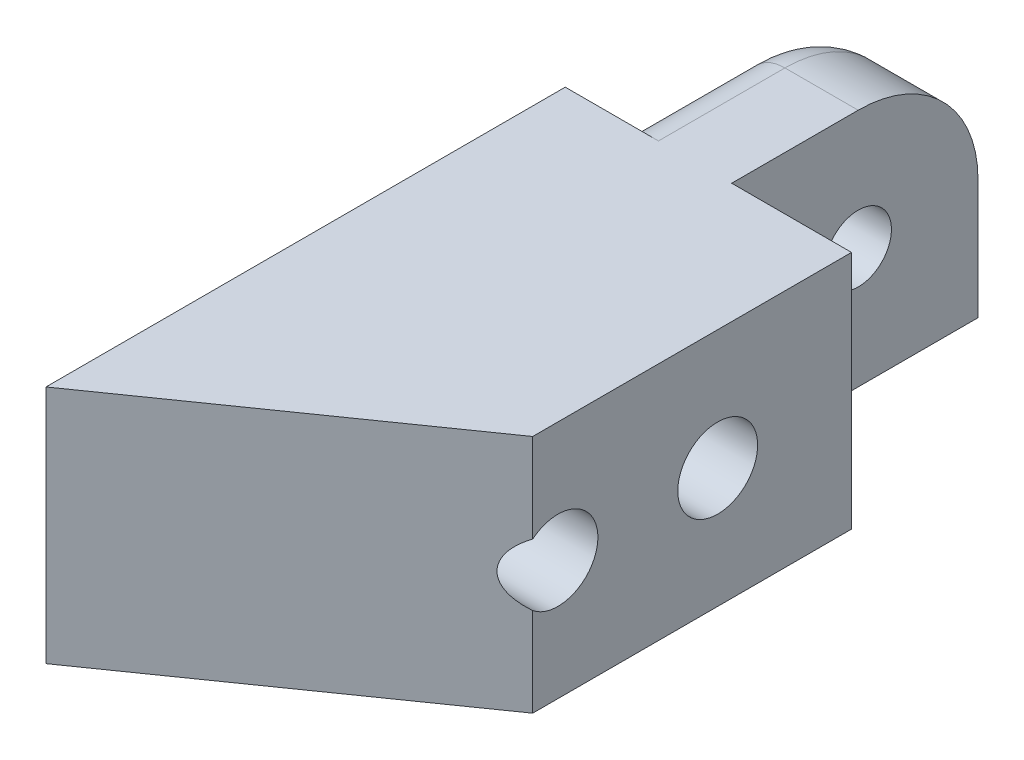
ISO-10303-21;
HEADER;
FILE_DESCRIPTION(('STEP AP214'),'2;1');
FILE_NAME('part.step','',(''),(''),'','','');
FILE_SCHEMA(('AUTOMOTIVE_DESIGN { 1 0 10303 214 1 1 1 1 }'));
ENDSEC;
DATA;
#1=APPLICATION_CONTEXT('core data for automotive mechanical design processes');
#2=APPLICATION_PROTOCOL_DEFINITION('international standard','automotive_design',2000,#1);
#3=PRODUCT_CONTEXT('',#1,'mechanical');
#4=PRODUCT('Part','Part','',(#3));
#5=PRODUCT_RELATED_PRODUCT_CATEGORY('part','',(#4));
#6=PRODUCT_DEFINITION_FORMATION('','',#4);
#7=PRODUCT_DEFINITION_CONTEXT('part definition',#1,'design');
#8=PRODUCT_DEFINITION('design','',#6,#7);
#9=PRODUCT_DEFINITION_SHAPE('','',#8);
#10=(LENGTH_UNIT() NAMED_UNIT(*) SI_UNIT(.MILLI.,.METRE.));
#11=(NAMED_UNIT(*) PLANE_ANGLE_UNIT() SI_UNIT($,.RADIAN.));
#12=(NAMED_UNIT(*) SI_UNIT($,.STERADIAN.) SOLID_ANGLE_UNIT());
#13=UNCERTAINTY_MEASURE_WITH_UNIT(LENGTH_MEASURE(1.E-05),#10,'distance_accuracy_value','');
#14=(GEOMETRIC_REPRESENTATION_CONTEXT(3) GLOBAL_UNCERTAINTY_ASSIGNED_CONTEXT((#13)) GLOBAL_UNIT_ASSIGNED_CONTEXT((#10,
#11,#12)) REPRESENTATION_CONTEXT('',''));
#15=CARTESIAN_POINT('',(0.,0.,0.));
#16=DIRECTION('',(0.,0.,1.));
#17=DIRECTION('',(1.,0.,0.));
#18=AXIS2_PLACEMENT_3D('',#15,#16,#17);
#19=CARTESIAN_POINT('',(-4.25000000000001,18.,-11.9727689642455));
#20=DIRECTION('',(0.,0.,1.));
#21=DIRECTION('',(1.,0.,0.));
#22=AXIS2_PLACEMENT_3D('',#19,#20,#21);
#23=PLANE('',#22);
#24=DIRECTION('',(-1.,0.,0.));
#25=VECTOR('',#24,1.);
#26=CARTESIAN_POINT('',(-4.25000000000001,0.,-11.9727689642455));
#27=LINE('',#26,#25);
#28=CARTESIAN_POINT('',(-4.25000000000001,0.,-11.9727689642455));
#29=VERTEX_POINT('',#28);
#30=CARTESIAN_POINT('',(-8.25000000000001,0.,-11.9727689642455));
#31=VERTEX_POINT('',#30);
#32=EDGE_CURVE('E208',#29,#31,#27,.T.);
#33=ORIENTED_EDGE('',*,*,#32,.T.);
#34=DIRECTION('',(0.,-1.,0.));
#35=VECTOR('',#34,1.);
#36=CARTESIAN_POINT('',(-8.25000000000001,18.,-11.9727689642455));
#37=LINE('',#36,#35);
#38=CARTESIAN_POINT('',(-8.25000000000001,18.,-11.9727689642455));
#39=VERTEX_POINT('',#38);
#40=EDGE_CURVE('E163',#39,#31,#37,.T.);
#41=ORIENTED_EDGE('',*,*,#40,.F.);
#42=DIRECTION('',(-1.,0.,0.));
#43=VECTOR('',#42,1.);
#44=CARTESIAN_POINT('',(-4.25000000000001,18.,-11.9727689642455));
#45=LINE('',#44,#43);
#46=CARTESIAN_POINT('',(-1.25000000000001,18.,-11.9727689642455));
#47=VERTEX_POINT('',#46);
#48=EDGE_CURVE('E209',#47,#39,#45,.T.);
#49=ORIENTED_EDGE('',*,*,#48,.F.);
#50=CARTESIAN_POINT('',(-1.25000000000001,15.,-11.9727689642455));
#51=DIRECTION('',(0.,0.,1.));
#52=DIRECTION('',(1.,0.,0.));
#53=AXIS2_PLACEMENT_3D('',#50,#51,#52);
#54=CIRCLE('',#53,3.);
#55=CARTESIAN_POINT('',(-4.25000000000001,15.,-11.9727689642455));
#56=VERTEX_POINT('',#55);
#57=EDGE_CURVE('E11',#47,#56,#54,.T.);
#58=ORIENTED_EDGE('',*,*,#57,.T.);
#59=DIRECTION('',(0.,-1.,0.));
#60=VECTOR('',#59,1.);
#61=CARTESIAN_POINT('',(-4.25000000000001,18.,-11.9727689642455));
#62=LINE('',#61,#60);
#63=EDGE_CURVE('E146',#56,#29,#62,.T.);
#64=ORIENTED_EDGE('',*,*,#63,.T.);
#65=EDGE_LOOP('',(#33,#41,#49,#58,#64));
#66=FACE_BOUND('',#65,.T.);
#67=ADVANCED_FACE('F33',(#66),#23,.F.);
#68=CARTESIAN_POINT('',(-8.25000000000001,18.,-11.9727689642455));
#69=DIRECTION('',(1.,0.,0.));
#70=DIRECTION('',(0.,0.,-1.));
#71=AXIS2_PLACEMENT_3D('',#68,#69,#70);
#72=PLANE('',#71);
#73=CARTESIAN_POINT('',(-8.25,9.,10.0772310357545));
#74=DIRECTION('',(-1.,0.,0.));
#75=DIRECTION('',(0.,0.,1.));
#76=AXIS2_PLACEMENT_3D('',#73,#74,#75);
#77=CIRCLE('',#76,3.);
#78=CARTESIAN_POINT('',(-8.25,9.,13.0772310357545));
#79=VERTEX_POINT('',#78);
#80=EDGE_CURVE('E189',#79,#79,#77,.T.);
#81=ORIENTED_EDGE('',*,*,#80,.F.);
#82=EDGE_LOOP('',(#81));
#83=FACE_BOUND('',#82,.T.);
#84=CARTESIAN_POINT('',(-8.25000000000001,9.,-1.92276896424554));
#85=DIRECTION('',(-1.,0.,0.));
#86=DIRECTION('',(0.,0.,1.));
#87=AXIS2_PLACEMENT_3D('',#84,#85,#86);
#88=CIRCLE('',#87,3.);
#89=CARTESIAN_POINT('',(-8.25000000000001,9.,1.07723103575446));
#90=VERTEX_POINT('',#89);
#91=EDGE_CURVE('E199',#90,#90,#88,.T.);
#92=ORIENTED_EDGE('',*,*,#91,.F.);
#93=EDGE_LOOP('',(#92));
#94=FACE_BOUND('',#93,.T.);
#95=DIRECTION('',(0.,0.,1.));
#96=VECTOR('',#95,1.);
#97=CARTESIAN_POINT('',(-8.25000000000001,0.,-11.9727689642455));
#98=LINE('',#97,#96);
#99=CARTESIAN_POINT('',(-8.25,0.,27.0272310357545));
#100=VERTEX_POINT('',#99);
#101=EDGE_CURVE('E224',#31,#100,#98,.T.);
#102=ORIENTED_EDGE('',*,*,#101,.T.);
#103=DIRECTION('',(0.,-1.,0.));
#104=VECTOR('',#103,1.);
#105=CARTESIAN_POINT('',(-8.25,18.,27.0272310357545));
#106=LINE('',#105,#104);
#107=CARTESIAN_POINT('',(-8.25,18.,27.0272310357545));
#108=VERTEX_POINT('',#107);
#109=EDGE_CURVE('E160',#108,#100,#106,.T.);
#110=ORIENTED_EDGE('',*,*,#109,.F.);
#111=DIRECTION('',(0.,0.,1.));
#112=VECTOR('',#111,1.);
#113=CARTESIAN_POINT('',(-8.25000000000001,18.,-11.9727689642455));
#114=LINE('',#113,#112);
#115=EDGE_CURVE('E212',#39,#108,#114,.T.);
#116=ORIENTED_EDGE('',*,*,#115,.F.);
#117=ORIENTED_EDGE('',*,*,#40,.T.);
#118=EDGE_LOOP('',(#102,#110,#116,#117));
#119=FACE_BOUND('',#118,.T.);
#120=ADVANCED_FACE('F260',(#83,#94,#119),#72,.F.);
#121=CARTESIAN_POINT('',(-8.25,18.,27.0272310357545));
#122=DIRECTION('',(-0.57357643635105,0.,-0.819152044288989));
#123=DIRECTION('',(-0.819152044288989,0.,0.57357643635105));
#124=AXIS2_PLACEMENT_3D('',#121,#122,#123);
#125=PLANE('',#124);
#126=DIRECTION('',(0.,-1.,0.));
#127=VECTOR('',#126,1.);
#128=CARTESIAN_POINT('',(13.25,18.,11.9727689642455));
#129=LINE('',#128,#127);
#130=CARTESIAN_POINT('',(13.25,6.6747180898541,11.9727689642455));
#131=VERTEX_POINT('',#130);
#132=CARTESIAN_POINT('',(13.25,0.,11.9727689642455));
#133=VERTEX_POINT('',#132);
#134=EDGE_CURVE('E156',#131,#133,#129,.T.);
#135=ORIENTED_EDGE('',*,*,#134,.F.);
#136=CARTESIAN_POINT('',(15.9571087142786,9.,10.0772310357545));
#137=DIRECTION('',(-0.57357643635105,0.,-0.819152044288989));
#138=DIRECTION('',(-0.819152044288989,0.,0.57357643635105));
#139=AXIS2_PLACEMENT_3D('',#136,#137,#138);
#140=ELLIPSE('',#139,5.23034038686326,3.);
#141=CARTESIAN_POINT('',(13.25,11.3252819101459,11.9727689642455));
#142=VERTEX_POINT('',#141);
#143=EDGE_CURVE('E205',#131,#142,#140,.T.);
#144=ORIENTED_EDGE('',*,*,#143,.T.);
#145=CARTESIAN_POINT('',(13.25,18.,11.9727689642455));
#146=VERTEX_POINT('',#145);
#147=EDGE_CURVE('E157',#146,#142,#129,.T.);
#148=ORIENTED_EDGE('',*,*,#147,.F.);
#149=DIRECTION('',(0.819152044288989,0.,-0.57357643635105));
#150=VECTOR('',#149,1.);
#151=CARTESIAN_POINT('',(-8.25,18.,27.0272310357545));
#152=LINE('',#151,#150);
#153=EDGE_CURVE('E215',#108,#146,#152,.T.);
#154=ORIENTED_EDGE('',*,*,#153,.F.);
#155=ORIENTED_EDGE('',*,*,#109,.T.);
#156=DIRECTION('',(0.819152044288989,0.,-0.57357643635105));
#157=VECTOR('',#156,1.);
#158=CARTESIAN_POINT('',(-8.25,0.,27.0272310357545));
#159=LINE('',#158,#157);
#160=EDGE_CURVE('E226',#100,#133,#159,.T.);
#161=ORIENTED_EDGE('',*,*,#160,.T.);
#162=EDGE_LOOP('',(#135,#144,#148,#154,#155,#161));
#163=FACE_BOUND('',#162,.T.);
#164=ADVANCED_FACE('F265',(#163),#125,.F.);
#165=CARTESIAN_POINT('',(13.25,18.,11.9727689642455));
#166=DIRECTION('',(-1.,0.,0.));
#167=DIRECTION('',(0.,0.,1.));
#168=AXIS2_PLACEMENT_3D('',#165,#166,#167);
#169=PLANE('',#168);
#170=CARTESIAN_POINT('',(13.25,9.,-1.92276896424554));
#171=DIRECTION('',(-1.,0.,0.));
#172=DIRECTION('',(0.,0.,1.));
#173=AXIS2_PLACEMENT_3D('',#170,#171,#172);
#174=CIRCLE('',#173,3.);
#175=CARTESIAN_POINT('',(13.25,9.,1.07723103575446));
#176=VERTEX_POINT('',#175);
#177=EDGE_CURVE('E139',#176,#176,#174,.T.);
#178=ORIENTED_EDGE('',*,*,#177,.T.);
#179=EDGE_LOOP('',(#178));
#180=FACE_BOUND('',#179,.T.);
#181=ORIENTED_EDGE('',*,*,#147,.T.);
#182=CARTESIAN_POINT('',(13.25,9.,10.0772310357545));
#183=DIRECTION('',(-1.,0.,0.));
#184=DIRECTION('',(0.,0.,1.));
#185=AXIS2_PLACEMENT_3D('',#182,#183,#184);
#186=CIRCLE('',#185,3.);
#187=EDGE_CURVE('E194',#142,#131,#186,.T.);
#188=ORIENTED_EDGE('',*,*,#187,.T.);
#189=ORIENTED_EDGE('',*,*,#134,.T.);
#190=DIRECTION('',(0.,0.,-1.));
#191=VECTOR('',#190,1.);
#192=CARTESIAN_POINT('',(13.25,0.,11.9727689642455));
#193=LINE('',#192,#191);
#194=CARTESIAN_POINT('',(13.25,0.,-11.9727689642455));
#195=VERTEX_POINT('',#194);
#196=EDGE_CURVE('E229',#133,#195,#193,.T.);
#197=ORIENTED_EDGE('',*,*,#196,.T.);
#198=DIRECTION('',(0.,-1.,0.));
#199=VECTOR('',#198,1.);
#200=CARTESIAN_POINT('',(13.25,18.,-11.9727689642455));
#201=LINE('',#200,#199);
#202=CARTESIAN_POINT('',(13.25,18.,-11.9727689642455));
#203=VERTEX_POINT('',#202);
#204=EDGE_CURVE('E148',#203,#195,#201,.T.);
#205=ORIENTED_EDGE('',*,*,#204,.F.);
#206=DIRECTION('',(0.,0.,-1.));
#207=VECTOR('',#206,1.);
#208=CARTESIAN_POINT('',(13.25,18.,11.9727689642455));
#209=LINE('',#208,#207);
#210=EDGE_CURVE('E217',#146,#203,#209,.T.);
#211=ORIENTED_EDGE('',*,*,#210,.F.);
#212=EDGE_LOOP('',(#181,#188,#189,#197,#205,#211));
#213=FACE_BOUND('',#212,.T.);
#214=ADVANCED_FACE('F369',(#180,#213),#169,.F.);
#215=CARTESIAN_POINT('',(13.25,18.,-11.9727689642455));
#216=DIRECTION('',(0.,0.,1.));
#217=DIRECTION('',(1.,0.,0.));
#218=AXIS2_PLACEMENT_3D('',#215,#216,#217);
#219=PLANE('',#218);
#220=DIRECTION('',(-1.,0.,0.));
#221=VECTOR('',#220,1.);
#222=CARTESIAN_POINT('',(13.25,0.,-11.9727689642455));
#223=LINE('',#222,#221);
#224=CARTESIAN_POINT('',(4.25,0.,-11.9727689642455));
#225=VERTEX_POINT('',#224);
#226=EDGE_CURVE('E231',#195,#225,#223,.T.);
#227=ORIENTED_EDGE('',*,*,#226,.T.);
#228=DIRECTION('',(0.,-1.,0.));
#229=VECTOR('',#228,1.);
#230=CARTESIAN_POINT('',(4.25,18.,-11.9727689642455));
#231=LINE('',#230,#229);
#232=CARTESIAN_POINT('',(4.25,18.,-11.9727689642455));
#233=VERTEX_POINT('',#232);
#234=EDGE_CURVE('E145',#233,#225,#231,.T.);
#235=ORIENTED_EDGE('',*,*,#234,.F.);
#236=DIRECTION('',(-1.,0.,0.));
#237=VECTOR('',#236,1.);
#238=CARTESIAN_POINT('',(13.25,18.,-11.9727689642455));
#239=LINE('',#238,#237);
#240=EDGE_CURVE('E219',#203,#233,#239,.T.);
#241=ORIENTED_EDGE('',*,*,#240,.F.);
#242=ORIENTED_EDGE('',*,*,#204,.T.);
#243=EDGE_LOOP('',(#227,#235,#241,#242));
#244=FACE_BOUND('',#243,.T.);
#245=ADVANCED_FACE('F361',(#244),#219,.F.);
#246=CARTESIAN_POINT('',(4.25,18.,-11.9727689642455));
#247=DIRECTION('',(-1.,0.,0.));
#248=DIRECTION('',(0.,0.,1.));
#249=AXIS2_PLACEMENT_3D('',#246,#247,#248);
#250=PLANE('',#249);
#251=CARTESIAN_POINT('',(4.25,9.,-21.4727689642455));
#252=DIRECTION('',(-1.,0.,0.));
#253=DIRECTION('',(0.,0.,1.));
#254=AXIS2_PLACEMENT_3D('',#251,#252,#253);
#255=CIRCLE('',#254,2.5);
#256=CARTESIAN_POINT('',(4.25,9.,-18.9727689642455));
#257=VERTEX_POINT('',#256);
#258=EDGE_CURVE('E170',#257,#257,#255,.T.);
#259=ORIENTED_EDGE('',*,*,#258,.T.);
#260=EDGE_LOOP('',(#259));
#261=FACE_BOUND('',#260,.T.);
#262=DIRECTION('',(0.,-1.,0.));
#263=VECTOR('',#262,1.);
#264=CARTESIAN_POINT('',(4.25,18.,-30.4727689642455));
#265=LINE('',#264,#263);
#266=CARTESIAN_POINT('',(4.25,9.,-30.4727689642455));
#267=VERTEX_POINT('',#266);
#268=CARTESIAN_POINT('',(4.25,0.,-30.4727689642455));
#269=VERTEX_POINT('',#268);
#270=EDGE_CURVE('E137',#267,#269,#265,.T.);
#271=ORIENTED_EDGE('',*,*,#270,.F.);
#272=CARTESIAN_POINT('',(4.25,9.,-21.4727689642455));
#273=DIRECTION('',(-1.,0.,0.));
#274=DIRECTION('',(0.,0.,1.));
#275=AXIS2_PLACEMENT_3D('',#272,#273,#274);
#276=CIRCLE('',#275,9.);
#277=CARTESIAN_POINT('',(4.25,18.,-21.4727689642455));
#278=VERTEX_POINT('',#277);
#279=EDGE_CURVE('E124',#267,#278,#276,.F.);
#280=ORIENTED_EDGE('',*,*,#279,.T.);
#281=DIRECTION('',(0.,0.,-1.));
#282=VECTOR('',#281,1.);
#283=CARTESIAN_POINT('',(4.25,18.,-11.9727689642455));
#284=LINE('',#283,#282);
#285=EDGE_CURVE('E150',#233,#278,#284,.T.);
#286=ORIENTED_EDGE('',*,*,#285,.F.);
#287=ORIENTED_EDGE('',*,*,#234,.T.);
#288=DIRECTION('',(0.,0.,-1.));
#289=VECTOR('',#288,1.);
#290=CARTESIAN_POINT('',(4.25,0.,-11.9727689642455));
#291=LINE('',#290,#289);
#292=EDGE_CURVE('E144',#225,#269,#291,.T.);
#293=ORIENTED_EDGE('',*,*,#292,.T.);
#294=EDGE_LOOP('',(#271,#280,#286,#287,#293));
#295=FACE_BOUND('',#294,.T.);
#296=ADVANCED_FACE('F141',(#261,#295),#250,.F.);
#297=CARTESIAN_POINT('',(4.25,18.,-30.4727689642455));
#298=DIRECTION('',(0.,0.,1.));
#299=DIRECTION('',(1.,0.,0.));
#300=AXIS2_PLACEMENT_3D('',#297,#298,#299);
#301=PLANE('',#300);
#302=DIRECTION('',(-1.,0.,0.));
#303=VECTOR('',#302,1.);
#304=CARTESIAN_POINT('',(4.25,0.,-30.4727689642455));
#305=LINE('',#304,#303);
#306=CARTESIAN_POINT('',(-1.25000000000001,0.,-30.4727689642455));
#307=VERTEX_POINT('',#306);
#308=EDGE_CURVE('E234',#269,#307,#305,.T.);
#309=ORIENTED_EDGE('',*,*,#308,.T.);
#310=DIRECTION('',(0.,-1.,0.));
#311=VECTOR('',#310,1.);
#312=CARTESIAN_POINT('',(-1.25000000000001,18.,-30.4727689642455));
#313=LINE('',#312,#311);
#314=CARTESIAN_POINT('',(-1.25000000000001,9.,-30.4727689642455));
#315=VERTEX_POINT('',#314);
#316=EDGE_CURVE('E42',#307,#315,#313,.F.);
#317=ORIENTED_EDGE('',*,*,#316,.T.);
#318=DIRECTION('',(-1.,0.,0.));
#319=VECTOR('',#318,1.);
#320=CARTESIAN_POINT('',(13.25,9.,-30.4727689642455));
#321=LINE('',#320,#319);
#322=EDGE_CURVE('E126',#267,#315,#321,.T.);
#323=ORIENTED_EDGE('',*,*,#322,.F.);
#324=ORIENTED_EDGE('',*,*,#270,.T.);
#325=EDGE_LOOP('',(#309,#317,#323,#324));
#326=FACE_BOUND('',#325,.T.);
#327=ADVANCED_FACE('F136',(#326),#301,.F.);
#328=CARTESIAN_POINT('',(-4.25,18.,-30.4727689642455));
#329=DIRECTION('',(1.,0.,0.));
#330=DIRECTION('',(0.,0.,-1.));
#331=AXIS2_PLACEMENT_3D('',#328,#329,#330);
#332=PLANE('',#331);
#333=CARTESIAN_POINT('',(-4.25,9.,-21.4727689642455));
#334=DIRECTION('',(1.,0.,0.));
#335=DIRECTION('',(0.,0.,-1.));
#336=AXIS2_PLACEMENT_3D('',#333,#334,#335);
#337=CIRCLE('',#336,2.5);
#338=CARTESIAN_POINT('',(-4.25,9.,-23.9727689642455));
#339=VERTEX_POINT('',#338);
#340=EDGE_CURVE('E134',#339,#339,#337,.T.);
#341=ORIENTED_EDGE('',*,*,#340,.T.);
#342=EDGE_LOOP('',(#341));
#343=FACE_BOUND('',#342,.T.);
#344=ORIENTED_EDGE('',*,*,#63,.F.);
#345=DIRECTION('',(0.,0.,1.));
#346=VECTOR('',#345,1.);
#347=CARTESIAN_POINT('',(-4.25,15.,-21.4727689642455));
#348=LINE('',#347,#346);
#349=CARTESIAN_POINT('',(-4.25,15.,-21.4727689642455));
#350=VERTEX_POINT('',#349);
#351=EDGE_CURVE('E177',#56,#350,#348,.F.);
#352=ORIENTED_EDGE('',*,*,#351,.T.);
#353=CARTESIAN_POINT('',(-4.25,9.,-21.4727689642455));
#354=DIRECTION('',(1.,0.,0.));
#355=DIRECTION('',(0.,0.,-1.));
#356=AXIS2_PLACEMENT_3D('',#353,#354,#355);
#357=CIRCLE('',#356,6.);
#358=CARTESIAN_POINT('',(-4.25,9.,-27.4727689642455));
#359=VERTEX_POINT('',#358);
#360=EDGE_CURVE('E175',#350,#359,#357,.F.);
#361=ORIENTED_EDGE('',*,*,#360,.T.);
#362=DIRECTION('',(0.,-1.,0.));
#363=VECTOR('',#362,1.);
#364=CARTESIAN_POINT('',(-4.25,18.,-27.4727689642455));
#365=LINE('',#364,#363);
#366=CARTESIAN_POINT('',(-4.25,0.,-27.4727689642455));
#367=VERTEX_POINT('',#366);
#368=EDGE_CURVE('E173',#359,#367,#365,.T.);
#369=ORIENTED_EDGE('',*,*,#368,.T.);
#370=DIRECTION('',(0.,0.,1.));
#371=VECTOR('',#370,1.);
#372=CARTESIAN_POINT('',(-4.25,0.,-30.4727689642455));
#373=LINE('',#372,#371);
#374=EDGE_CURVE('E213',#367,#29,#373,.T.);
#375=ORIENTED_EDGE('',*,*,#374,.T.);
#376=EDGE_LOOP('',(#344,#352,#361,#369,#375));
#377=FACE_BOUND('',#376,.T.);
#378=ADVANCED_FACE('F239',(#343,#377),#332,.F.);
#379=CARTESIAN_POINT('',(0.,18.,0.));
#380=DIRECTION('',(0.,1.,0.));
#381=DIRECTION('',(0.,0.,1.));
#382=AXIS2_PLACEMENT_3D('',#379,#380,#381);
#383=PLANE('',#382);
#384=DIRECTION('',(-1.,0.,0.));
#385=VECTOR('',#384,1.);
#386=CARTESIAN_POINT('',(13.25,18.,-21.4727689642455));
#387=LINE('',#386,#385);
#388=CARTESIAN_POINT('',(-1.25,18.,-21.4727689642455));
#389=VERTEX_POINT('',#388);
#390=EDGE_CURVE('E129',#389,#278,#387,.F.);
#391=ORIENTED_EDGE('',*,*,#390,.F.);
#392=DIRECTION('',(0.,0.,1.));
#393=VECTOR('',#392,1.);
#394=CARTESIAN_POINT('',(-1.25000000000001,18.,-11.9727689642455));
#395=LINE('',#394,#393);
#396=EDGE_CURVE('E167',#389,#47,#395,.T.);
#397=ORIENTED_EDGE('',*,*,#396,.T.);
#398=ORIENTED_EDGE('',*,*,#48,.T.);
#399=ORIENTED_EDGE('',*,*,#115,.T.);
#400=ORIENTED_EDGE('',*,*,#153,.T.);
#401=ORIENTED_EDGE('',*,*,#210,.T.);
#402=ORIENTED_EDGE('',*,*,#240,.T.);
#403=ORIENTED_EDGE('',*,*,#285,.T.);
#404=EDGE_LOOP('',(#391,#397,#398,#399,#400,#401,#402,#403));
#405=FACE_BOUND('',#404,.T.);
#406=ADVANCED_FACE('F248',(#405),#383,.T.);
#407=CARTESIAN_POINT('',(0.,0.,0.));
#408=DIRECTION('',(0.,1.,0.));
#409=DIRECTION('',(0.,0.,1.));
#410=AXIS2_PLACEMENT_3D('',#407,#408,#409);
#411=PLANE('',#410);
#412=ORIENTED_EDGE('',*,*,#374,.F.);
#413=CARTESIAN_POINT('',(-1.25,0.,-27.4727689642455));
#414=DIRECTION('',(0.,1.,0.));
#415=DIRECTION('',(0.,0.,1.));
#416=AXIS2_PLACEMENT_3D('',#413,#414,#415);
#417=CIRCLE('',#416,3.);
#418=EDGE_CURVE('E50',#367,#307,#417,.F.);
#419=ORIENTED_EDGE('',*,*,#418,.T.);
#420=ORIENTED_EDGE('',*,*,#308,.F.);
#421=ORIENTED_EDGE('',*,*,#292,.F.);
#422=ORIENTED_EDGE('',*,*,#226,.F.);
#423=ORIENTED_EDGE('',*,*,#196,.F.);
#424=ORIENTED_EDGE('',*,*,#160,.F.);
#425=ORIENTED_EDGE('',*,*,#101,.F.);
#426=ORIENTED_EDGE('',*,*,#32,.F.);
#427=EDGE_LOOP('',(#412,#419,#420,#421,#422,#423,#424,#425,#426));
#428=FACE_BOUND('',#427,.T.);
#429=ADVANCED_FACE('F241',(#428),#411,.F.);
#430=CARTESIAN_POINT('',(13.25,9.,-21.4727689642455));
#431=DIRECTION('',(-1.,0.,0.));
#432=DIRECTION('',(0.,0.,1.));
#433=AXIS2_PLACEMENT_3D('',#430,#431,#432);
#434=CYLINDRICAL_SURFACE('',#433,9.);
#435=ORIENTED_EDGE('',*,*,#322,.T.);
#436=CARTESIAN_POINT('',(-1.25,9.,-21.4727689642455));
#437=DIRECTION('',(1.,0.,0.));
#438=DIRECTION('',(0.,0.,-1.));
#439=AXIS2_PLACEMENT_3D('',#436,#437,#438);
#440=CIRCLE('',#439,9.);
#441=EDGE_CURVE('E179',#315,#389,#440,.T.);
#442=ORIENTED_EDGE('',*,*,#441,.T.);
#443=ORIENTED_EDGE('',*,*,#390,.T.);
#444=ORIENTED_EDGE('',*,*,#279,.F.);
#445=EDGE_LOOP('',(#435,#442,#443,#444));
#446=FACE_BOUND('',#445,.T.);
#447=ADVANCED_FACE('F125',(#446),#434,.T.);
#448=CARTESIAN_POINT('',(13.25,9.,-21.4727689642455));
#449=DIRECTION('',(-1.,0.,0.));
#450=DIRECTION('',(0.,0.,1.));
#451=AXIS2_PLACEMENT_3D('',#448,#449,#450);
#452=CYLINDRICAL_SURFACE('',#451,2.5);
#453=ORIENTED_EDGE('',*,*,#340,.F.);
#454=EDGE_LOOP('',(#453));
#455=FACE_BOUND('',#454,.T.);
#456=ORIENTED_EDGE('',*,*,#258,.F.);
#457=EDGE_LOOP('',(#456));
#458=FACE_BOUND('',#457,.T.);
#459=ADVANCED_FACE('F291',(#455,#458),#452,.F.);
#460=CARTESIAN_POINT('',(13.25,9.,-1.92276896424554));
#461=DIRECTION('',(-1.,0.,0.));
#462=DIRECTION('',(0.,0.,1.));
#463=AXIS2_PLACEMENT_3D('',#460,#461,#462);
#464=CYLINDRICAL_SURFACE('',#463,3.);
#465=ORIENTED_EDGE('',*,*,#177,.F.);
#466=EDGE_LOOP('',(#465));
#467=FACE_BOUND('',#466,.T.);
#468=ORIENTED_EDGE('',*,*,#91,.T.);
#469=EDGE_LOOP('',(#468));
#470=FACE_BOUND('',#469,.T.);
#471=ADVANCED_FACE('F257',(#467,#470),#464,.F.);
#472=CARTESIAN_POINT('',(13.25,9.,10.0772310357545));
#473=DIRECTION('',(-1.,0.,0.));
#474=DIRECTION('',(0.,0.,1.));
#475=AXIS2_PLACEMENT_3D('',#472,#473,#474);
#476=CYLINDRICAL_SURFACE('',#475,3.);
#477=ORIENTED_EDGE('',*,*,#80,.T.);
#478=EDGE_LOOP('',(#477));
#479=FACE_BOUND('',#478,.T.);
#480=ORIENTED_EDGE('',*,*,#187,.F.);
#481=ORIENTED_EDGE('',*,*,#143,.F.);
#482=EDGE_LOOP('',(#480,#481));
#483=FACE_BOUND('',#482,.T.);
#484=ADVANCED_FACE('F252',(#479,#483),#476,.F.);
#485=CARTESIAN_POINT('',(-1.25,18.,-27.4727689642455));
#486=DIRECTION('',(0.,-1.,0.));
#487=DIRECTION('',(0.,0.,-1.));
#488=AXIS2_PLACEMENT_3D('',#485,#486,#487);
#489=CYLINDRICAL_SURFACE('',#488,3.);
#490=ORIENTED_EDGE('',*,*,#418,.F.);
#491=ORIENTED_EDGE('',*,*,#368,.F.);
#492=CARTESIAN_POINT('',(-1.25,9.,-27.4727689642455));
#493=DIRECTION('',(0.,1.,0.));
#494=DIRECTION('',(0.,0.,1.));
#495=AXIS2_PLACEMENT_3D('',#492,#493,#494);
#496=CIRCLE('',#495,3.);
#497=EDGE_CURVE('E37',#315,#359,#496,.T.);
#498=ORIENTED_EDGE('',*,*,#497,.F.);
#499=ORIENTED_EDGE('',*,*,#316,.F.);
#500=EDGE_LOOP('',(#490,#491,#498,#499));
#501=FACE_BOUND('',#500,.T.);
#502=ADVANCED_FACE('F35',(#501),#489,.T.);
#503=CARTESIAN_POINT('',(-1.25,9.,-21.4727689642455));
#504=DIRECTION('',(1.,0.,0.));
#505=DIRECTION('',(0.,0.,-1.));
#506=AXIS2_PLACEMENT_3D('',#503,#504,#505);
#507=TOROIDAL_SURFACE('',#506,6.,3.);
#508=ORIENTED_EDGE('',*,*,#497,.T.);
#509=ORIENTED_EDGE('',*,*,#360,.F.);
#510=CARTESIAN_POINT('',(-1.25,15.,-21.4727689642455));
#511=DIRECTION('',(0.,0.,1.));
#512=DIRECTION('',(1.,0.,0.));
#513=AXIS2_PLACEMENT_3D('',#510,#511,#512);
#514=CIRCLE('',#513,3.);
#515=EDGE_CURVE('E182',#389,#350,#514,.T.);
#516=ORIENTED_EDGE('',*,*,#515,.F.);
#517=ORIENTED_EDGE('',*,*,#441,.F.);
#518=EDGE_LOOP('',(#508,#509,#516,#517));
#519=FACE_BOUND('',#518,.T.);
#520=ADVANCED_FACE('F249',(#519),#507,.T.);
#521=CARTESIAN_POINT('',(-1.25000000000001,15.,0.));
#522=DIRECTION('',(0.,0.,-1.));
#523=DIRECTION('',(-1.,0.,0.));
#524=AXIS2_PLACEMENT_3D('',#521,#522,#523);
#525=CYLINDRICAL_SURFACE('',#524,3.);
#526=ORIENTED_EDGE('',*,*,#515,.T.);
#527=ORIENTED_EDGE('',*,*,#351,.F.);
#528=ORIENTED_EDGE('',*,*,#57,.F.);
#529=ORIENTED_EDGE('',*,*,#396,.F.);
#530=EDGE_LOOP('',(#526,#527,#528,#529));
#531=FACE_BOUND('',#530,.T.);
#532=ADVANCED_FACE('F246',(#531),#525,.T.);
#533=CLOSED_SHELL('',(#67,#120,#164,#214,#245,#296,#327,#378,#406,#429,#447,#459,#471,#484,#502,
#520,#532));
#534=MANIFOLD_SOLID_BREP('B2',#533);
#535=ADVANCED_BREP_SHAPE_REPRESENTATION('',(#18,#534),#14);
#536=SHAPE_DEFINITION_REPRESENTATION(#9,#535);
ENDSEC;
END-ISO-10303-21;
